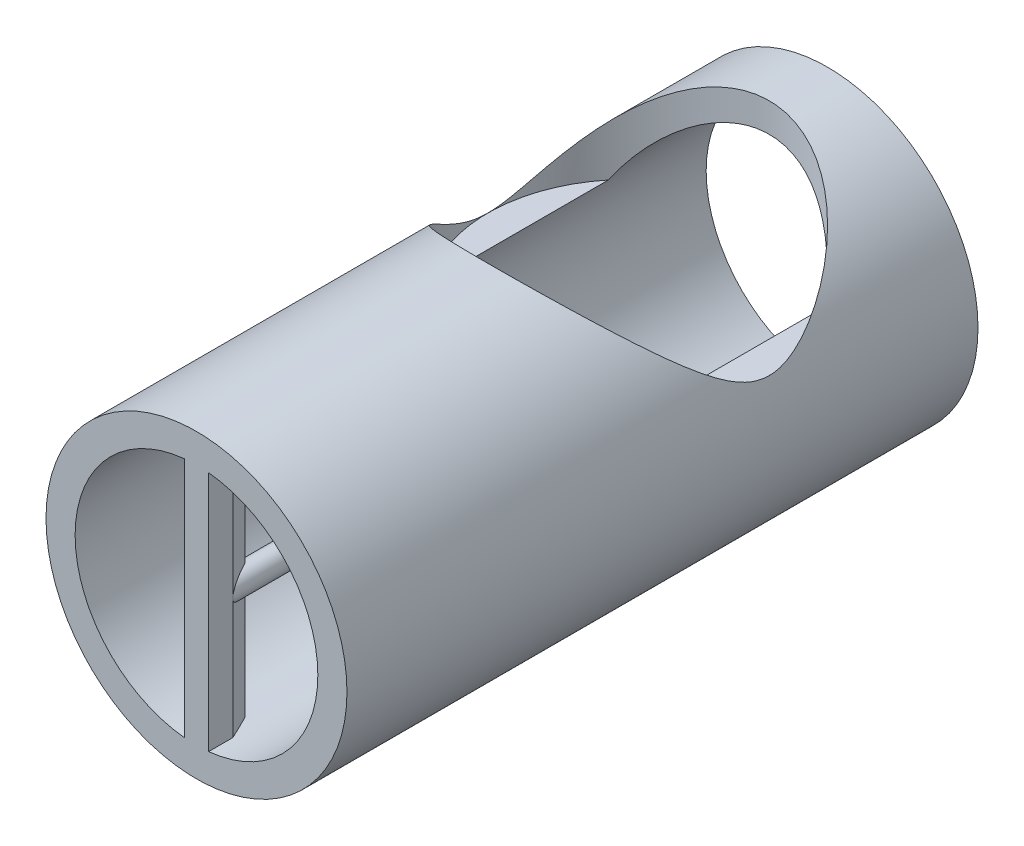
ISO-10303-21;
HEADER;
FILE_DESCRIPTION(('STEP AP214'),'2;1');
FILE_NAME('part.step','',(''),(''),'','','');
FILE_SCHEMA(('AUTOMOTIVE_DESIGN { 1 0 10303 214 1 1 1 1 }'));
ENDSEC;
DATA;
#1=APPLICATION_CONTEXT('core data for automotive mechanical design processes');
#2=APPLICATION_PROTOCOL_DEFINITION('international standard','automotive_design',2000,#1);
#3=PRODUCT_CONTEXT('',#1,'mechanical');
#4=PRODUCT('Part','Part','',(#3));
#5=PRODUCT_RELATED_PRODUCT_CATEGORY('part','',(#4));
#6=PRODUCT_DEFINITION_FORMATION('','',#4);
#7=PRODUCT_DEFINITION_CONTEXT('part definition',#1,'design');
#8=PRODUCT_DEFINITION('design','',#6,#7);
#9=PRODUCT_DEFINITION_SHAPE('','',#8);
#10=(LENGTH_UNIT() NAMED_UNIT(*) SI_UNIT(.MILLI.,.METRE.));
#11=(NAMED_UNIT(*) PLANE_ANGLE_UNIT() SI_UNIT($,.RADIAN.));
#12=(NAMED_UNIT(*) SI_UNIT($,.STERADIAN.) SOLID_ANGLE_UNIT());
#13=UNCERTAINTY_MEASURE_WITH_UNIT(LENGTH_MEASURE(1.E-05),#10,'distance_accuracy_value','');
#14=(GEOMETRIC_REPRESENTATION_CONTEXT(3) GLOBAL_UNCERTAINTY_ASSIGNED_CONTEXT((#13)) GLOBAL_UNIT_ASSIGNED_CONTEXT((#10,
#11,#12)) REPRESENTATION_CONTEXT('',''));
#15=CARTESIAN_POINT('',(0.,0.,0.));
#16=DIRECTION('',(0.,0.,1.));
#17=DIRECTION('',(1.,0.,0.));
#18=AXIS2_PLACEMENT_3D('',#15,#16,#17);
#19=CARTESIAN_POINT('',(0.,-500000.,120.));
#20=DIRECTION('',(-0.894427190999915,0.,-0.447213595499959));
#21=DIRECTION('',(-0.447213595499959,0.,0.894427190999916));
#22=AXIS2_PLACEMENT_3D('',#19,#20,#21);
#23=PLANE('',#22);
#24=CARTESIAN_POINT('',(0.,0.,120.));
#25=DIRECTION('',(-0.894427190999915,0.,-0.447213595499959));
#26=DIRECTION('',(-0.447213595499959,0.,0.894427190999916));
#27=AXIS2_PLACEMENT_3D('',#24,#25,#26);
#28=ELLIPSE('',#27,5.59016994374947,2.5);
#29=CARTESIAN_POINT('',(-2.5,-1.13686837721616E-10,125.));
#30=VERTEX_POINT('',#29);
#31=CARTESIAN_POINT('',(0.,2.49999999965667,120.));
#32=VERTEX_POINT('',#31);
#33=EDGE_CURVE('E51',#30,#32,#28,.T.);
#34=ORIENTED_EDGE('',*,*,#33,.F.);
#35=DIRECTION('',(0.,1.,0.));
#36=VECTOR('',#35,1.);
#37=CARTESIAN_POINT('',(-2.5,-500000.,125.));
#38=LINE('',#37,#36);
#39=CARTESIAN_POINT('',(-2.5,24.8746859273297,125.));
#40=VERTEX_POINT('',#39);
#41=EDGE_CURVE('E153',#30,#40,#38,.T.);
#42=ORIENTED_EDGE('',*,*,#41,.T.);
#43=CARTESIAN_POINT('',(0.,0.,120.));
#44=DIRECTION('',(0.894427190999915,0.,0.447213595499959));
#45=DIRECTION('',(0.447213595499959,0.,-0.894427190999916));
#46=AXIS2_PLACEMENT_3D('',#43,#44,#45);
#47=ELLIPSE('',#46,55.9016994374947,25.);
#48=CARTESIAN_POINT('',(0.,24.9999999996362,120.));
#49=VERTEX_POINT('',#48);
#50=EDGE_CURVE('E145',#40,#49,#47,.F.);
#51=ORIENTED_EDGE('',*,*,#50,.T.);
#52=DIRECTION('',(0.,1.,0.));
#53=VECTOR('',#52,1.);
#54=CARTESIAN_POINT('',(0.,-500000.,120.));
#55=LINE('',#54,#53);
#56=EDGE_CURVE('E157',#32,#49,#55,.T.);
#57=ORIENTED_EDGE('',*,*,#56,.F.);
#58=EDGE_LOOP('',(#34,#42,#51,#57));
#59=FACE_BOUND('',#58,.T.);
#60=ADVANCED_FACE('F35',(#59),#23,.T.);
#61=CARTESIAN_POINT('',(0.,-500000.,120.));
#62=DIRECTION('',(0.894427190999915,0.,-0.447213595499959));
#63=DIRECTION('',(-0.447213595499959,0.,-0.894427190999916));
#64=AXIS2_PLACEMENT_3D('',#61,#62,#63);
#65=PLANE('',#64);
#66=CARTESIAN_POINT('',(0.,0.,120.));
#67=DIRECTION('',(0.894427190999915,0.,-0.447213595499959));
#68=DIRECTION('',(0.447213595499959,0.,0.894427190999916));
#69=AXIS2_PLACEMENT_3D('',#66,#67,#68);
#70=ELLIPSE('',#69,5.59016994374947,2.5);
#71=CARTESIAN_POINT('',(2.5,0.,125.));
#72=VERTEX_POINT('',#71);
#73=CARTESIAN_POINT('',(0.,-2.50000000033879,120.));
#74=VERTEX_POINT('',#73);
#75=EDGE_CURVE('E127',#72,#74,#70,.T.);
#76=ORIENTED_EDGE('',*,*,#75,.F.);
#77=DIRECTION('',(0.,1.,0.));
#78=VECTOR('',#77,1.);
#79=CARTESIAN_POINT('',(2.5,-500000.,125.));
#80=LINE('',#79,#78);
#81=CARTESIAN_POINT('',(2.5,-24.8746859276655,125.));
#82=VERTEX_POINT('',#81);
#83=EDGE_CURVE('E108',#82,#72,#80,.T.);
#84=ORIENTED_EDGE('',*,*,#83,.F.);
#85=CARTESIAN_POINT('',(0.,0.,120.));
#86=DIRECTION('',(0.894427190999915,0.,-0.447213595499959));
#87=DIRECTION('',(-0.447213595499959,0.,-0.894427190999916));
#88=AXIS2_PLACEMENT_3D('',#85,#86,#87);
#89=ELLIPSE('',#88,55.9016994374947,25.);
#90=CARTESIAN_POINT('',(0.,-25.,120.));
#91=VERTEX_POINT('',#90);
#92=EDGE_CURVE('E159',#91,#82,#89,.F.);
#93=ORIENTED_EDGE('',*,*,#92,.F.);
#94=EDGE_CURVE('E130',#91,#74,#55,.T.);
#95=ORIENTED_EDGE('',*,*,#94,.T.);
#96=EDGE_LOOP('',(#76,#84,#93,#95));
#97=FACE_BOUND('',#96,.T.);
#98=ADVANCED_FACE('F128',(#97),#65,.T.);
#99=CARTESIAN_POINT('',(0.,0.,130.));
#100=DIRECTION('',(0.,0.,-1.));
#101=DIRECTION('',(-1.,0.,0.));
#102=AXIS2_PLACEMENT_3D('',#99,#100,#101);
#103=CYLINDRICAL_SURFACE('',#102,25.);
#104=DIRECTION('',(0.,0.,-1.));
#105=VECTOR('',#104,1.);
#106=CARTESIAN_POINT('',(-2.5,-24.8746859276655,130.));
#107=LINE('',#106,#105);
#108=CARTESIAN_POINT('',(-2.5,-24.8746859276655,130.));
#109=VERTEX_POINT('',#108);
#110=CARTESIAN_POINT('',(-2.49999999999761,-24.8746859276657,124.999999999995));
#111=VERTEX_POINT('',#110);
#112=EDGE_CURVE('E162',#109,#111,#107,.T.);
#113=ORIENTED_EDGE('',*,*,#112,.T.);
#114=CARTESIAN_POINT('',(0.,0.,120.));
#115=DIRECTION('',(-0.894427190999915,0.,-0.447213595499959));
#116=DIRECTION('',(0.447213595499959,0.,-0.894427190999916));
#117=AXIS2_PLACEMENT_3D('',#114,#115,#116);
#118=ELLIPSE('',#117,55.9016994374947,25.);
#119=EDGE_CURVE('E164',#111,#91,#118,.F.);
#120=ORIENTED_EDGE('',*,*,#119,.T.);
#121=ORIENTED_EDGE('',*,*,#92,.T.);
#122=DIRECTION('',(0.,0.,-1.));
#123=VECTOR('',#122,1.);
#124=CARTESIAN_POINT('',(2.5,-24.8746859276655,130.));
#125=LINE('',#124,#123);
#126=CARTESIAN_POINT('',(2.5,-24.8746859277844,130.));
#127=VERTEX_POINT('',#126);
#128=EDGE_CURVE('E115',#82,#127,#125,.F.);
#129=ORIENTED_EDGE('',*,*,#128,.T.);
#130=CARTESIAN_POINT('',(0.,0.,130.));
#131=DIRECTION('',(0.,0.,1.));
#132=DIRECTION('',(1.,0.,0.));
#133=AXIS2_PLACEMENT_3D('',#130,#131,#132);
#134=CIRCLE('',#133,25.);
#135=CARTESIAN_POINT('',(2.49999999998817,24.8746859276667,130.));
#136=VERTEX_POINT('',#135);
#137=EDGE_CURVE('E177',#127,#136,#134,.T.);
#138=ORIENTED_EDGE('',*,*,#137,.T.);
#139=DIRECTION('',(0.,0.,-1.));
#140=VECTOR('',#139,1.);
#141=CARTESIAN_POINT('',(2.5,24.8746859276655,130.));
#142=LINE('',#141,#140);
#143=CARTESIAN_POINT('',(2.5,24.8746859276655,125.));
#144=VERTEX_POINT('',#143);
#145=EDGE_CURVE('E141',#144,#136,#142,.F.);
#146=ORIENTED_EDGE('',*,*,#145,.F.);
#147=CARTESIAN_POINT('',(0.,0.,120.));
#148=DIRECTION('',(-0.894427190999915,0.,0.447213595499959));
#149=DIRECTION('',(-0.447213595499959,0.,-0.894427190999916));
#150=AXIS2_PLACEMENT_3D('',#147,#148,#149);
#151=ELLIPSE('',#150,55.9016994374947,25.);
#152=EDGE_CURVE('E124',#49,#144,#151,.F.);
#153=ORIENTED_EDGE('',*,*,#152,.F.);
#154=ORIENTED_EDGE('',*,*,#50,.F.);
#155=DIRECTION('',(0.,0.,-1.));
#156=VECTOR('',#155,1.);
#157=CARTESIAN_POINT('',(-2.5,24.8746859276655,130.));
#158=LINE('',#157,#156);
#159=CARTESIAN_POINT('',(-2.5,24.8746859276655,130.));
#160=VERTEX_POINT('',#159);
#161=EDGE_CURVE('E143',#160,#40,#158,.T.);
#162=ORIENTED_EDGE('',*,*,#161,.F.);
#163=EDGE_CURVE('E216',#160,#109,#134,.T.);
#164=ORIENTED_EDGE('',*,*,#163,.T.);
#165=EDGE_LOOP('',(#113,#120,#121,#129,#138,#146,#153,#154,#162,#164));
#166=FACE_BOUND('',#165,.T.);
#167=CARTESIAN_POINT('',(0.,0.,0.));
#168=DIRECTION('',(0.,0.,1.));
#169=DIRECTION('',(1.,0.,0.));
#170=AXIS2_PLACEMENT_3D('',#167,#168,#169);
#171=CIRCLE('',#170,25.);
#172=CARTESIAN_POINT('',(25.,0.,0.));
#173=VERTEX_POINT('',#172);
#174=EDGE_CURVE('E176',#173,#173,#171,.T.);
#175=ORIENTED_EDGE('',*,*,#174,.F.);
#176=EDGE_LOOP('',(#175));
#177=FACE_BOUND('',#176,.T.);
#178=CARTESIAN_POINT('',(22.4743742960733,10.95,59.3276430563234));
#179=CARTESIAN_POINT('',(22.3019667083182,11.3037942212565,59.5390901029748));
#180=CARTESIAN_POINT('',(22.1220062083574,11.6519990272461,59.753646243183));
#181=CARTESIAN_POINT('',(21.7471646299782,12.3374955462132,60.1870423380014));
#182=CARTESIAN_POINT('',(21.5522849025751,12.6747882434144,60.405881903392));
#183=CARTESIAN_POINT('',(21.1476300871424,13.3390015573137,60.8460895123145));
#184=CARTESIAN_POINT('',(20.9378455943647,13.6659154334671,61.0674590769942));
#185=CARTESIAN_POINT('',(20.5035619866832,14.3092474384923,61.5109802440593));
#186=CARTESIAN_POINT('',(20.2790624669886,14.625665278271,61.7331318677988));
#187=CARTESIAN_POINT('',(19.5795063668447,15.5645745760457,62.4023717124672));
#188=CARTESIAN_POINT('',(19.0818003536356,16.1711250172771,62.8484848216621));
#189=CARTESIAN_POINT('',(18.0263581578649,17.3398369519749,63.7271202977906));
#190=CARTESIAN_POINT('',(17.4686424726122,17.9020134890678,64.1596472405025));
#191=CARTESIAN_POINT('',(16.4114713979435,18.8697674088573,64.9164524239288));
#192=CARTESIAN_POINT('',(15.9229916706646,19.2840441660308,65.2449531621064));
#193=CARTESIAN_POINT('',(14.9075161135777,20.0793879733808,65.8822265839081));
#194=CARTESIAN_POINT('',(14.3805218768934,20.4604563957672,66.1910000825456));
#195=CARTESIAN_POINT('',(13.2903561179992,21.1847415952306,66.7827433053698));
#196=CARTESIAN_POINT('',(12.7273081621061,21.528077743543,67.0657938849646));
#197=CARTESIAN_POINT('',(11.5648381171561,22.1742291664302,67.6019536389646));
#198=CARTESIAN_POINT('',(10.9654233744445,22.4770525855074,67.8550688302592));
#199=CARTESIAN_POINT('',(9.84913431381633,22.9846953384824,68.2815147432458));
#200=CARTESIAN_POINT('',(9.33806130892662,23.1972214584249,68.4608843309504));
#201=CARTESIAN_POINT('',(8.29548014062666,23.5901509402475,68.7936016043488));
#202=CARTESIAN_POINT('',(7.76397425938417,23.7705578769489,68.946952185833));
#203=CARTESIAN_POINT('',(6.68311418470487,24.0967758224872,69.2249414576358));
#204=CARTESIAN_POINT('',(6.13376100025002,24.2425887832088,69.3495817678531));
#205=CARTESIAN_POINT('',(5.02046202300811,24.4973671948911,69.567755737929));
#206=CARTESIAN_POINT('',(4.45651605234143,24.6063321964636,69.661289018414));
#207=CARTESIAN_POINT('',(3.3151446007866,24.7859880434769,69.8156741807081));
#208=CARTESIAN_POINT('',(2.7376655547893,24.8564834540152,69.8763591728327));
#209=CARTESIAN_POINT('',(1.57658573948294,24.9570411730376,69.9629634007423));
#210=CARTESIAN_POINT('',(0.992984959715098,24.9871034124315,69.9888825771214));
#211=CARTESIAN_POINT('',(-0.175294620092876,25.0062099656625,70.0053531926622));
#212=CARTESIAN_POINT('',(-0.759973234393823,24.9952607869556,69.9959102428828));
#213=CARTESIAN_POINT('',(-1.92547633868596,24.9325707360905,69.9418870969705));
#214=CARTESIAN_POINT('',(-2.50630102122905,24.8808319175958,69.8973086698271));
#215=CARTESIAN_POINT('',(-3.61166501476056,24.7434844240643,69.7791402561338));
#216=CARTESIAN_POINT('',(-4.1368914702396,24.6610255447947,69.7082500382798));
#217=CARTESIAN_POINT('',(-5.17671937593841,24.4638831371384,69.5390787466375));
#218=CARTESIAN_POINT('',(-5.69132153712214,24.3492017725909,69.4407995121098));
#219=CARTESIAN_POINT('',(-6.70699615280654,24.0892304743416,69.2185485117049));
#220=CARTESIAN_POINT('',(-7.20806928276045,23.943942071933,69.0945780311852));
#221=CARTESIAN_POINT('',(-8.19434588170743,23.624593822159,68.8229112463909));
#222=CARTESIAN_POINT('',(-8.67954838769014,23.4505322327365,68.6752135055774));
#223=CARTESIAN_POINT('',(-9.66528721001278,23.0625656280626,68.3472203128465));
#224=CARTESIAN_POINT('',(-10.1645467091083,22.8467325959106,68.1653729993755));
#225=CARTESIAN_POINT('',(-11.1410201906496,22.3868038464551,67.779717778957));
#226=CARTESIAN_POINT('',(-11.6182336841592,22.1427075027486,67.5759093852905));
#227=CARTESIAN_POINT('',(-12.5498726719313,21.6283175646381,67.1488726002661));
#228=CARTESIAN_POINT('',(-13.0042769987812,21.3580002946056,66.9256266771791));
#229=CARTESIAN_POINT('',(-13.889207366557,20.793399429605,66.4625091004891));
#230=CARTESIAN_POINT('',(-14.3197284901996,20.4991109297893,66.222634045837));
#231=CARTESIAN_POINT('',(-15.0533368062141,19.9637027544719,65.789737731696));
#232=CARTESIAN_POINT('',(-15.3616977937813,19.7273360827789,65.5997248716302));
#233=CARTESIAN_POINT('',(-15.9644465845346,19.2428150382415,65.2129033958806));
#234=CARTESIAN_POINT('',(-16.2588366450119,18.9946625826856,65.01609588695));
#235=CARTESIAN_POINT('',(-17.1214114065351,18.2331015939417,64.4168199080071));
#236=CARTESIAN_POINT('',(-17.6687806018851,17.7027508921876,64.0056293228935));
#237=CARTESIAN_POINT('',(-18.7079772540656,16.6007691605572,63.1688268217915));
#238=CARTESIAN_POINT('',(-19.1997944216842,16.0291305154674,62.7432122531442));
#239=CARTESIAN_POINT('',(-20.128070528792,14.846734468062,61.886812834448));
#240=CARTESIAN_POINT('',(-20.5645587763765,14.235998036332,61.4560308551111));
#241=CARTESIAN_POINT('',(-21.2492030013533,13.1805903160196,60.7390723178791));
#242=CARTESIAN_POINT('',(-21.5124112441779,12.7465818015702,60.4514736104248));
#243=CARTESIAN_POINT('',(-21.887847489492,12.0824886020625,60.0251900789776));
#244=CARTESIAN_POINT('',(-22.0096022085189,11.8592746919453,59.8841472909865));
#245=CARTESIAN_POINT('',(-22.2467652468319,11.4081690793529,59.6041700849085));
#246=CARTESIAN_POINT('',(-22.3621729856259,11.1802769516189,59.4652358605085));
#247=CARTESIAN_POINT('',(-22.4743742960733,10.95,59.3276430563234));
#248=B_SPLINE_CURVE_WITH_KNOTS('',3,(#178,#179,#180,#181,#182,#183,#184,#185,#186,#187,#188,
#189,#190,#191,#192,#193,#194,#195,#196,#197,#198,#199,#200,#201,#202,#203,#204,#205,#206,#207,
#208,#209,#210,#211,#212,#213,#214,#215,#216,#217,#218,#219,#220,#221,#222,#223,#224,#225,#226,
#227,#228,#229,#230,#231,#232,#233,#234,#235,#236,#237,#238,#239,#240,#241,#242,#243,#244,#245,
#246,#247),.UNSPECIFIED.,.F.,.F.,(4,2,2,2,2,2,2,2,2,2,2,2,2,2,2,2,2,2,2,2,2,2,2,2,2,2,2,2,2,2,2,
2,2,2,4),(0.,1.34014474584248,2.68016827767678,4.02104499094421,5.36195860544389,
8.06638426766958,10.7698891028818,12.9274929793113,15.0850076585408,17.2354873322471,
19.3855340311673,21.1293748113673,22.8730213829757,24.6165695499755,26.3601389800772,
28.1124856051795,29.8648352245974,31.6169068030324,33.3688901743713,34.9761950729561,
36.583392061854,38.1905086605647,39.797722596949,41.5166029699499,43.2355214459951,
44.9560066920428,46.676844861941,47.9739182305634,49.2707813117535,51.8654130237684,
54.4605245218661,57.0542555761574,58.8036229900976,59.6758001678601,60.5480569823711),.UNSPECIFIED.);
#249=CARTESIAN_POINT('',(22.4743742960733,10.95,59.3276430563234));
#250=VERTEX_POINT('',#249);
#251=CARTESIAN_POINT('',(-22.4743742960733,10.95,59.3276430563234));
#252=VERTEX_POINT('',#251);
#253=EDGE_CURVE('E44',#250,#252,#248,.T.);
#254=ORIENTED_EDGE('',*,*,#253,.F.);
#255=DIRECTION('',(0.,0.,-1.));
#256=VECTOR('',#255,1.);
#257=CARTESIAN_POINT('',(22.4743742960733,10.95,130.));
#258=LINE('',#257,#256);
#259=CARTESIAN_POINT('',(22.4743742960733,10.95,22.6723569436766));
#260=VERTEX_POINT('',#259);
#261=EDGE_CURVE('E11',#250,#260,#258,.T.);
#262=ORIENTED_EDGE('',*,*,#261,.T.);
#263=CARTESIAN_POINT('',(-22.4743742960733,10.95,22.6723569436766));
#264=CARTESIAN_POINT('',(-22.3019667083182,11.3037942212565,22.4609098970252));
#265=CARTESIAN_POINT('',(-22.1220062083574,11.6519990272461,22.246353756817));
#266=CARTESIAN_POINT('',(-21.7471646299782,12.3374955462132,21.8129576619986));
#267=CARTESIAN_POINT('',(-21.5522849025751,12.6747882434144,21.594118096608));
#268=CARTESIAN_POINT('',(-21.1476300871424,13.3390015573137,21.1539104876855));
#269=CARTESIAN_POINT('',(-20.9378455943647,13.6659154334671,20.9325409230058));
#270=CARTESIAN_POINT('',(-20.5035619866832,14.3092474384923,20.4890197559407));
#271=CARTESIAN_POINT('',(-20.2790624669886,14.625665278271,20.2668681322012));
#272=CARTESIAN_POINT('',(-19.5795063668447,15.5645745760457,19.5976282875328));
#273=CARTESIAN_POINT('',(-19.0818003536356,16.1711250172771,19.1515151783379));
#274=CARTESIAN_POINT('',(-18.0263581578649,17.3398369519749,18.2728797022094));
#275=CARTESIAN_POINT('',(-17.4686424726122,17.9020134890678,17.8403527594975));
#276=CARTESIAN_POINT('',(-16.4114713979435,18.8697674088573,17.0835475760712));
#277=CARTESIAN_POINT('',(-15.9229916706646,19.2840441660308,16.7550468378936));
#278=CARTESIAN_POINT('',(-14.9075161135777,20.0793879733808,16.1177734160919));
#279=CARTESIAN_POINT('',(-14.3805218768934,20.4604563957672,15.8089999174544));
#280=CARTESIAN_POINT('',(-13.2903561179992,21.1847415952306,15.2172566946302));
#281=CARTESIAN_POINT('',(-12.7273081621061,21.528077743543,14.9342061150354));
#282=CARTESIAN_POINT('',(-11.5648381171561,22.1742291664302,14.3980463610354));
#283=CARTESIAN_POINT('',(-10.9654233744445,22.4770525855074,14.1449311697408));
#284=CARTESIAN_POINT('',(-9.84913431381633,22.9846953384824,13.7184852567542));
#285=CARTESIAN_POINT('',(-9.33806130892662,23.1972214584248,13.5391156690496));
#286=CARTESIAN_POINT('',(-8.29548014062667,23.5901509402475,13.2063983956512));
#287=CARTESIAN_POINT('',(-7.76397425938417,23.7705578769489,13.053047814167));
#288=CARTESIAN_POINT('',(-6.68311418470488,24.0967758224872,12.7750585423642));
#289=CARTESIAN_POINT('',(-6.13376100025003,24.2425887832088,12.6504182321469));
#290=CARTESIAN_POINT('',(-5.02046202300812,24.4973671948911,12.432244262071));
#291=CARTESIAN_POINT('',(-4.45651605234144,24.6063321964636,12.338710981586));
#292=CARTESIAN_POINT('',(-3.31514460078661,24.7859880434769,12.1843258192919));
#293=CARTESIAN_POINT('',(-2.73766555478931,24.8564834540152,12.1236408271674));
#294=CARTESIAN_POINT('',(-1.57658573948295,24.9570411730376,12.0370365992577));
#295=CARTESIAN_POINT('',(-0.992984959715112,24.9871034124315,12.0111174228786));
#296=CARTESIAN_POINT('',(0.17529462009286,25.0062099656625,11.9946468073378));
#297=CARTESIAN_POINT('',(0.759973234393806,24.9952607869556,12.0040897571172));
#298=CARTESIAN_POINT('',(1.92547633868595,24.9325707360905,12.0581129030295));
#299=CARTESIAN_POINT('',(2.50630102122904,24.8808319175958,12.1026913301729));
#300=CARTESIAN_POINT('',(3.61166501476055,24.7434844240643,12.2208597438662));
#301=CARTESIAN_POINT('',(4.13689147023959,24.6610255447947,12.2917499617202));
#302=CARTESIAN_POINT('',(5.1767193759384,24.4638831371384,12.4609212533625));
#303=CARTESIAN_POINT('',(5.69132153712213,24.3492017725909,12.5592004878902));
#304=CARTESIAN_POINT('',(6.70699615280653,24.0892304743416,12.7814514882951));
#305=CARTESIAN_POINT('',(7.20806928276044,23.943942071933,12.9054219688148));
#306=CARTESIAN_POINT('',(8.19434588170742,23.624593822159,13.1770887536091));
#307=CARTESIAN_POINT('',(8.67954838769013,23.4505322327365,13.3247864944226));
#308=CARTESIAN_POINT('',(9.66528721001277,23.0625656280626,13.6527796871535));
#309=CARTESIAN_POINT('',(10.1645467091083,22.8467325959106,13.8346270006245));
#310=CARTESIAN_POINT('',(11.1410201906496,22.3868038464551,14.2202822210429));
#311=CARTESIAN_POINT('',(11.6182336841592,22.1427075027486,14.4240906147095));
#312=CARTESIAN_POINT('',(12.5498726719313,21.6283175646381,14.8511273997339));
#313=CARTESIAN_POINT('',(13.0042769987812,21.3580002946056,15.074373322821));
#314=CARTESIAN_POINT('',(13.889207366557,20.793399429605,15.5374908995109));
#315=CARTESIAN_POINT('',(14.3197284901996,20.4991109297893,15.777365954163));
#316=CARTESIAN_POINT('',(15.0533368062141,19.9637027544719,16.210262268304));
#317=CARTESIAN_POINT('',(15.3616977937813,19.7273360827789,16.4002751283698));
#318=CARTESIAN_POINT('',(15.9644465845346,19.2428150382415,16.7870966041194));
#319=CARTESIAN_POINT('',(16.2588366450118,18.9946625826856,16.98390411305));
#320=CARTESIAN_POINT('',(17.1214114065351,18.2331015939417,17.5831800919929));
#321=CARTESIAN_POINT('',(17.6687806018851,17.7027508921876,17.9943706771065));
#322=CARTESIAN_POINT('',(18.7079772540656,16.6007691605572,18.8311731782085));
#323=CARTESIAN_POINT('',(19.1997944216842,16.0291305154674,19.2567877468558));
#324=CARTESIAN_POINT('',(20.128070528792,14.846734468062,20.113187165552));
#325=CARTESIAN_POINT('',(20.5645587763765,14.235998036332,20.5439691448889));
#326=CARTESIAN_POINT('',(21.2492030013533,13.1805903160196,21.2609276821209));
#327=CARTESIAN_POINT('',(21.5124112441779,12.7465818015702,21.5485263895752));
#328=CARTESIAN_POINT('',(21.887847489492,12.0824886020625,21.9748099210224));
#329=CARTESIAN_POINT('',(22.0096022085189,11.8592746919453,22.1158527090135));
#330=CARTESIAN_POINT('',(22.2467652468319,11.4081690793529,22.3958299150915));
#331=CARTESIAN_POINT('',(22.3621729856259,11.1802769516189,22.5347641394915));
#332=CARTESIAN_POINT('',(22.4743742960733,10.95,22.6723569436766));
#333=B_SPLINE_CURVE_WITH_KNOTS('',3,(#263,#264,#265,#266,#267,#268,#269,#270,#271,#272,#273,
#274,#275,#276,#277,#278,#279,#280,#281,#282,#283,#284,#285,#286,#287,#288,#289,#290,#291,#292,
#293,#294,#295,#296,#297,#298,#299,#300,#301,#302,#303,#304,#305,#306,#307,#308,#309,#310,#311,
#312,#313,#314,#315,#316,#317,#318,#319,#320,#321,#322,#323,#324,#325,#326,#327,#328,#329,#330,
#331,#332),.UNSPECIFIED.,.F.,.F.,(4,2,2,2,2,2,2,2,2,2,2,2,2,2,2,2,2,2,2,2,2,2,2,2,2,2,2,2,2,2,2,
2,2,2,4),(0.,1.34014474584249,2.68016827767678,4.02104499094421,5.36195860544389,
8.06638426766957,10.7698891028818,12.9274929793113,15.0850076585407,17.2354873322471,
19.3855340311673,21.1293748113673,22.8730213829757,24.6165695499755,26.3601389800772,
28.1124856051795,29.8648352245974,31.6169068030324,33.3688901743713,34.9761950729561,
36.583392061854,38.1905086605647,39.797722596949,41.5166029699499,43.2355214459951,
44.9560066920428,46.676844861941,47.9739182305634,49.2707813117535,51.8654130237684,
54.4605245218661,57.0542555761574,58.8036229900976,59.6758001678601,60.5480569823711),.UNSPECIFIED.);
#334=CARTESIAN_POINT('',(-22.4743742960733,10.95,22.6723569436766));
#335=VERTEX_POINT('',#334);
#336=EDGE_CURVE('E194',#335,#260,#333,.T.);
#337=ORIENTED_EDGE('',*,*,#336,.F.);
#338=DIRECTION('',(0.,0.,-1.));
#339=VECTOR('',#338,1.);
#340=CARTESIAN_POINT('',(-22.4743742960733,10.95,130.));
#341=LINE('',#340,#339);
#342=EDGE_CURVE('E207',#335,#252,#341,.F.);
#343=ORIENTED_EDGE('',*,*,#342,.T.);
#344=EDGE_LOOP('',(#254,#262,#337,#343));
#345=FACE_BOUND('',#344,.T.);
#346=ADVANCED_FACE('F188',(#166,#177,#345),#103,.F.);
#347=CARTESIAN_POINT('',(0.,0.,130.));
#348=DIRECTION('',(0.,0.,1.));
#349=DIRECTION('',(1.,0.,0.));
#350=AXIS2_PLACEMENT_3D('',#347,#348,#349);
#351=PLANE('',#350);
#352=ORIENTED_EDGE('',*,*,#163,.F.);
#353=DIRECTION('',(0.,1.,0.));
#354=VECTOR('',#353,1.);
#355=CARTESIAN_POINT('',(-2.5,-500000.,130.));
#356=LINE('',#355,#354);
#357=EDGE_CURVE('E151',#109,#160,#356,.T.);
#358=ORIENTED_EDGE('',*,*,#357,.F.);
#359=EDGE_LOOP('',(#352,#358));
#360=FACE_BOUND('',#359,.T.);
#361=DIRECTION('',(0.,1.,0.));
#362=VECTOR('',#361,1.);
#363=CARTESIAN_POINT('',(2.5,-500000.,130.));
#364=LINE('',#363,#362);
#365=EDGE_CURVE('E119',#127,#136,#364,.T.);
#366=ORIENTED_EDGE('',*,*,#365,.T.);
#367=ORIENTED_EDGE('',*,*,#137,.F.);
#368=EDGE_LOOP('',(#366,#367));
#369=FACE_BOUND('',#368,.T.);
#370=CARTESIAN_POINT('',(0.,0.,130.));
#371=DIRECTION('',(0.,0.,1.));
#372=DIRECTION('',(1.,0.,0.));
#373=AXIS2_PLACEMENT_3D('',#370,#371,#372);
#374=CIRCLE('',#373,31.);
#375=CARTESIAN_POINT('',(31.,0.,130.));
#376=VERTEX_POINT('',#375);
#377=EDGE_CURVE('E209',#376,#376,#374,.T.);
#378=ORIENTED_EDGE('',*,*,#377,.T.);
#379=EDGE_LOOP('',(#378));
#380=FACE_BOUND('',#379,.T.);
#381=ADVANCED_FACE('F233',(#360,#369,#380),#351,.T.);
#382=CARTESIAN_POINT('',(0.,0.,0.));
#383=DIRECTION('',(0.,0.,1.));
#384=DIRECTION('',(1.,0.,0.));
#385=AXIS2_PLACEMENT_3D('',#382,#383,#384);
#386=PLANE('',#385);
#387=CARTESIAN_POINT('',(0.,0.,0.));
#388=DIRECTION('',(0.,0.,1.));
#389=DIRECTION('',(1.,0.,0.));
#390=AXIS2_PLACEMENT_3D('',#387,#388,#389);
#391=CIRCLE('',#390,31.);
#392=CARTESIAN_POINT('',(31.,0.,0.));
#393=VERTEX_POINT('',#392);
#394=EDGE_CURVE('E212',#393,#393,#391,.T.);
#395=ORIENTED_EDGE('',*,*,#394,.F.);
#396=EDGE_LOOP('',(#395));
#397=FACE_BOUND('',#396,.T.);
#398=ORIENTED_EDGE('',*,*,#174,.T.);
#399=EDGE_LOOP('',(#398));
#400=FACE_BOUND('',#399,.T.);
#401=ADVANCED_FACE('F236',(#397,#400),#386,.F.);
#402=CARTESIAN_POINT('',(0.,0.,130.));
#403=DIRECTION('',(0.,0.,-1.));
#404=DIRECTION('',(-1.,0.,0.));
#405=AXIS2_PLACEMENT_3D('',#402,#403,#404);
#406=CYLINDRICAL_SURFACE('',#405,31.);
#407=CARTESIAN_POINT('',(0.,31.,70.));
#408=CARTESIAN_POINT('',(-0.663476460951134,31.0000006688418,70.0000006760147));
#409=CARTESIAN_POINT('',(-1.32694472503453,30.9786593200945,69.9771908917686));
#410=CARTESIAN_POINT('',(-2.64804227733868,30.8937859066056,69.886437393459));
#411=CARTESIAN_POINT('',(-3.3056716240038,30.8302542646492,69.8184941316742));
#412=CARTESIAN_POINT('',(-4.60984908205656,30.6623837667219,69.6388337913666));
#413=CARTESIAN_POINT('',(-5.25639298094963,30.558029741832,69.5271004411461));
#414=CARTESIAN_POINT('',(-6.53331210972513,30.3107048752081,69.2620081438586));
#415=CARTESIAN_POINT('',(-7.16368692994254,30.1677330560974,69.1086481432632));
#416=CARTESIAN_POINT('',(-8.40027546388511,29.8469575625866,68.7640919921698));
#417=CARTESIAN_POINT('',(-9.00661696526691,29.6693803432953,68.5731417508109));
#418=CARTESIAN_POINT('',(-10.1962119281453,29.2818822597091,68.1557479007108));
#419=CARTESIAN_POINT('',(-10.779466017348,29.0719622755174,67.9293052577769));
#420=CARTESIAN_POINT('',(-11.9206160309951,28.6229792271756,67.4439677821929));
#421=CARTESIAN_POINT('',(-12.47851183932,28.3839160295927,67.185072800959));
#422=CARTESIAN_POINT('',(-13.5675434447839,27.8797756743982,66.6377311000745));
#423=CARTESIAN_POINT('',(-14.0986730788055,27.6146925665475,66.3492776203136));
#424=CARTESIAN_POINT('',(-14.9791961359444,27.1439404825786,65.8354729668611));
#425=CARTESIAN_POINT('',(-15.3356648911216,26.944044792128,65.6168649695009));
#426=CARTESIAN_POINT('',(-16.0345967421318,26.5340505840314,65.1674223069109));
#427=CARTESIAN_POINT('',(-16.3770627532522,26.3239542102363,64.9365902098711));
#428=CARTESIAN_POINT('',(-17.3836862668733,25.6796080122045,64.2267480654489));
#429=CARTESIAN_POINT('',(-18.0269167109951,25.2313834401978,63.7304818210384));
#430=CARTESIAN_POINT('',(-19.2590030555795,24.3040603764164,62.6965391767546));
#431=CARTESIAN_POINT('',(-19.8476937971443,23.8248751168649,62.1587454940371));
#432=CARTESIAN_POINT('',(-20.9695514961933,22.8436633940546,61.0474735351565));
#433=CARTESIAN_POINT('',(-21.5027240333369,22.3416392334392,60.4739988542574));
#434=CARTESIAN_POINT('',(-22.3286321423887,21.5090375311366,59.5114438901453));
#435=CARTESIAN_POINT('',(-22.6377085246247,21.1832698449197,59.1320679949102));
#436=CARTESIAN_POINT('',(-23.2344858313911,20.5269421535818,58.3607733250829));
#437=CARTESIAN_POINT('',(-23.5221855338007,20.1963818757541,57.9688538351939));
#438=CARTESIAN_POINT('',(-24.0766578212336,19.5320728059757,57.1725117310288));
#439=CARTESIAN_POINT('',(-24.3434154254364,19.1983219196784,56.7680804496792));
#440=CARTESIAN_POINT('',(-24.8560238705907,18.5298528700541,55.9469838178608));
#441=CARTESIAN_POINT('',(-25.1018754596035,18.1951347417804,55.5303189058555));
#442=CARTESIAN_POINT('',(-25.5722609704841,17.5278536307685,54.68549046494));
#443=CARTESIAN_POINT('',(-25.7968474160297,17.195287334269,54.2573588055309));
#444=CARTESIAN_POINT('',(-26.2254978824162,16.5341595874992,53.3878276757953));
#445=CARTESIAN_POINT('',(-26.4295597339817,16.2055985637707,52.9464268094167));
#446=CARTESIAN_POINT('',(-26.8168140389206,15.5563862654052,52.0497398334796));
#447=CARTESIAN_POINT('',(-27.0000302415806,15.2357263222931,51.5944702898379));
#448=CARTESIAN_POINT('',(-27.3454855623099,14.6066079048162,50.6679311466867));
#449=CARTESIAN_POINT('',(-27.507730996262,14.2981457762844,50.1966664187771));
#450=CARTESIAN_POINT('',(-27.7655005811603,13.7888568632939,49.3786694031693));
#451=CARTESIAN_POINT('',(-27.8665133927025,13.5833124096863,49.0366047889212));
#452=CARTESIAN_POINT('',(-28.0574345276058,13.184430289061,48.3423434542607));
#453=CARTESIAN_POINT('',(-28.1473428840356,12.991092585693,47.990146764025));
#454=CARTESIAN_POINT('',(-28.3153771673228,12.6206477773955,47.2748916636036));
#455=CARTESIAN_POINT('',(-28.3935126111929,12.44352760844,46.9118423141578));
#456=CARTESIAN_POINT('',(-28.5372327360181,12.1102956047716,46.1737444664484));
#457=CARTESIAN_POINT('',(-28.6028197299408,11.9541799000308,45.7986981943974));
#458=CARTESIAN_POINT('',(-28.7083850487817,11.6980242944964,45.1137630043318));
#459=CARTESIAN_POINT('',(-28.75085895404,11.5930358345575,44.8061197358659));
#460=CARTESIAN_POINT('',(-28.8264473134536,11.4037857498489,44.1834298219036));
#461=CARTESIAN_POINT('',(-28.8595650756631,11.3195168006461,43.8683858358624));
#462=CARTESIAN_POINT('',(-28.9156850626181,11.1753819832896,43.2326407608482));
#463=CARTESIAN_POINT('',(-28.9387125602452,11.1154551737034,42.911955922632));
#464=CARTESIAN_POINT('',(-28.9741544045898,11.0227434888663,42.2660686090358));
#465=CARTESIAN_POINT('',(-28.9865696422864,10.9899563350447,41.9408665152437));
#466=CARTESIAN_POINT('',(-29.0004504217608,10.9532773473328,41.286125593985));
#467=CARTESIAN_POINT('',(-29.0018332335399,10.9496038322699,40.9565725292281));
#468=CARTESIAN_POINT('',(-28.9933845412,10.9719543983877,40.2986353782192));
#469=CARTESIAN_POINT('',(-28.9835528622202,10.9979789426322,39.9702513102747));
#470=CARTESIAN_POINT('',(-28.9529661865855,11.0782471925287,39.316860734462));
#471=CARTESIAN_POINT('',(-28.9321896171807,11.132546626503,38.9918621943078));
#472=CARTESIAN_POINT('',(-28.880293593105,11.2664887345168,38.348010651285));
#473=CARTESIAN_POINT('',(-28.8491721959099,11.3461361682167,38.0291588145341));
#474=CARTESIAN_POINT('',(-28.7619483240957,11.565879835846,37.2643441240877));
#475=CARTESIAN_POINT('',(-28.7008528407412,11.7172676757471,36.8222022590843));
#476=CARTESIAN_POINT('',(-28.5610202321176,12.0540993914406,35.9540299319445));
#477=CARTESIAN_POINT('',(-28.4822723381379,12.2395640430092,35.5280094907621));
#478=CARTESIAN_POINT('',(-28.3084165766223,12.6364817290526,34.6899000807743));
#479=CARTESIAN_POINT('',(-28.2132501354087,12.8480270080874,34.2778675391595));
#480=CARTESIAN_POINT('',(-28.0079059352482,13.2897160100511,33.4679537722903));
#481=CARTESIAN_POINT('',(-27.897730156062,13.5198572785068,33.0700706894086));
#482=CARTESIAN_POINT('',(-27.653192445734,14.0136767538162,32.2537129103376));
#483=CARTESIAN_POINT('',(-27.5175733497036,14.2785454523947,31.8363401941335));
#484=CARTESIAN_POINT('',(-27.2301191033252,14.8193955612481,31.014503920536));
#485=CARTESIAN_POINT('',(-27.0782803173219,15.0953794543292,30.6100432838945));
#486=CARTESIAN_POINT('',(-26.7586061270561,15.6550621374864,29.8124300259972));
#487=CARTESIAN_POINT('',(-26.590757541371,15.938767144872,29.4192870757464));
#488=CARTESIAN_POINT('',(-26.2393358511123,16.5109051515182,28.6436865394181));
#489=CARTESIAN_POINT('',(-26.0557639352112,16.7993377920424,28.2612281484895));
#490=CARTESIAN_POINT('',(-25.6726237130275,17.3792214459453,27.5057028031887));
#491=CARTESIAN_POINT('',(-25.4730320161157,17.6706763112563,27.1326506663129));
#492=CARTESIAN_POINT('',(-25.0580277853765,18.254412350534,26.3961007601852));
#493=CARTESIAN_POINT('',(-24.8426141066519,18.5466935828235,26.0326036849381));
#494=CARTESIAN_POINT('',(-24.1726678772658,19.4221964009731,24.9564152719137));
#495=CARTESIAN_POINT('',(-23.6942120572192,20.0044111640083,24.2575969050068));
#496=CARTESIAN_POINT('',(-22.6250886647247,21.2087843103085,22.8349757893643));
#497=CARTESIAN_POINT('',(-22.0281433831571,21.829678814665,22.1148059651314));
#498=CARTESIAN_POINT('',(-20.7542230319433,23.0442459545229,20.7231061946381));
#499=CARTESIAN_POINT('',(-20.0772217820731,23.6379095963003,20.0515922764527));
#500=CARTESIAN_POINT('',(-18.6435599090236,24.7842039214685,18.7662229745577));
#501=CARTESIAN_POINT('',(-17.8871667340114,25.3369623122165,18.1521864034127));
#502=CARTESIAN_POINT('',(-16.6917922875916,26.1268473642795,17.2802371675391));
#503=CARTESIAN_POINT('',(-16.2833083504181,26.3835435701881,16.9978333877219));
#504=CARTESIAN_POINT('',(-15.4459417472114,26.8823431513439,16.4505993024153));
#505=CARTESIAN_POINT('',(-15.0170550453863,27.1244436178106,16.1857724987819));
#506=CARTESIAN_POINT('',(-14.0360291677112,27.6471909481633,15.6152979305776));
#507=CARTESIAN_POINT('',(-13.4786221967596,27.9235153961109,15.3146943304602));
#508=CARTESIAN_POINT('',(-12.3345885953485,28.4473826689705,14.746128272631));
#509=CARTESIAN_POINT('',(-11.747971093652,28.6949344061799,14.4781557062804));
#510=CARTESIAN_POINT('',(-10.5474081121686,29.1576028448181,13.9782539560945));
#511=CARTESIAN_POINT('',(-9.93347258565842,29.3727312363165,13.7463117807577));
#512=CARTESIAN_POINT('',(-8.6808038523352,29.767007625865,13.3218330467916));
#513=CARTESIAN_POINT('',(-8.04206983258784,29.9461544431911,13.1292977812837));
#514=CARTESIAN_POINT('',(-6.73820033913175,30.2663329860151,12.7855558542661));
#515=CARTESIAN_POINT('',(-6.07289057262651,30.4070381862686,12.6347031309067));
#516=CARTESIAN_POINT('',(-4.72576783908347,30.6453080136029,12.3794304063568));
#517=CARTESIAN_POINT('',(-4.04395491316904,30.7428727481715,12.2750102894759));
#518=CARTESIAN_POINT('',(-2.67004976411464,30.8925240735606,12.1149025610382));
#519=CARTESIAN_POINT('',(-1.97796353543701,30.9446362011164,12.0591875853279));
#520=CARTESIAN_POINT('',(-0.589672221660055,31.0021736170994,11.9976743683676));
#521=CARTESIAN_POINT('',(0.106532394440973,31.0076041229303,11.9918705487627));
#522=CARTESIAN_POINT('',(1.4130715730927,30.9738258211782,12.0279805888844));
#523=CARTESIAN_POINT('',(2.0237119865014,30.9398811958742,12.0642672268599));
#524=CARTESIAN_POINT('',(3.23843220135102,30.8364074475944,12.1749343146641));
#525=CARTESIAN_POINT('',(3.84251261964042,30.7668817004895,12.2493111505656));
#526=CARTESIAN_POINT('',(5.04000848268795,30.5935356627561,12.4348898151786));
#527=CARTESIAN_POINT('',(5.63342305544026,30.4897125814127,12.5460946405218));
#528=CARTESIAN_POINT('',(6.805889097363,30.24959522803,12.8035433732557));
#529=CARTESIAN_POINT('',(7.38493990434921,30.1132994620275,12.9497888927573));
#530=CARTESIAN_POINT('',(8.52875384136582,29.8096040285636,13.2760740646544));
#531=CARTESIAN_POINT('',(9.09341920533895,29.6420350290353,13.4562977522085));
#532=CARTESIAN_POINT('',(10.2025830317012,29.2787957328137,13.8475936324019));
#533=CARTESIAN_POINT('',(10.7470820578056,29.0831262223686,14.0586649619315));
#534=CARTESIAN_POINT('',(11.8140869719172,28.6662776881194,14.5091944107576));
#535=CARTESIAN_POINT('',(12.3365919841966,28.4450976498805,14.74865365892));
#536=CARTESIAN_POINT('',(13.3584100300945,27.9797804758616,15.2535880095258));
#537=CARTESIAN_POINT('',(13.8577181176647,27.73563847739,15.5190686230599));
#538=CARTESIAN_POINT('',(14.7078961692642,27.2918573135166,16.0029550948303));
#539=CARTESIAN_POINT('',(15.0641534516917,27.0967429197365,16.2161047211702));
#540=CARTESIAN_POINT('',(15.7629943422393,26.6962581016602,16.6546070803162));
#541=CARTESIAN_POINT('',(16.1055803233457,26.4908894712899,16.8799576792029));
#542=CARTESIAN_POINT('',(17.1130341106002,25.8606196223329,17.5733293672047));
#543=CARTESIAN_POINT('',(17.7574282843298,25.4216437474089,18.0585731871924));
#544=CARTESIAN_POINT('',(18.9929901956995,24.5123802139347,19.0704256026738));
#545=CARTESIAN_POINT('',(19.5839893174116,24.042000997353,19.5971560354176));
#546=CARTESIAN_POINT('',(20.7114261115955,23.0778408474187,20.6861866749593));
#547=CARTESIAN_POINT('',(21.2478690127685,22.5840621633473,21.248483464662));
#548=CARTESIAN_POINT('',(22.0835285535647,21.7606824119934,22.1967863683777));
#549=CARTESIAN_POINT('',(22.3985711036705,21.4360385658373,22.5733028998776));
#550=CARTESIAN_POINT('',(23.0071209425128,20.7815304050821,23.3389827113077));
#551=CARTESIAN_POINT('',(23.3006290868669,20.4516662985312,23.7281454878824));
#552=CARTESIAN_POINT('',(23.86660592244,19.7882633945774,24.519048082457));
#553=CARTESIAN_POINT('',(24.1390593673041,19.4547221304823,24.9207967238313));
#554=CARTESIAN_POINT('',(24.6629548824155,18.7861382831801,25.7365262180057));
#555=CARTESIAN_POINT('',(24.9143976768539,18.4510957521381,26.1505066485365));
#556=CARTESIAN_POINT('',(25.3958849006883,17.7825276951315,26.9899114368128));
#557=CARTESIAN_POINT('',(25.6259806810443,17.4490004664386,27.4153049816404));
#558=CARTESIAN_POINT('',(26.065595023007,16.7852075897066,28.2791632570947));
#559=CARTESIAN_POINT('',(26.2751116403007,16.4549422524963,28.7176292177075));
#560=CARTESIAN_POINT('',(26.6732840614543,15.8013345448546,29.6081782341238));
#561=CARTESIAN_POINT('',(26.8619615891161,15.4779852538879,30.0602464723001));
#562=CARTESIAN_POINT('',(27.2184042022425,14.8422066353761,30.9799339685496));
#563=CARTESIAN_POINT('',(27.3861749489983,14.5297743682014,31.4475489731176));
#564=CARTESIAN_POINT('',(27.6546789877948,14.0099199928186,32.262408235013));
#565=CARTESIAN_POINT('',(27.7607429995814,13.7983220587585,32.6052304860342));
#566=CARTESIAN_POINT('',(27.961661990718,13.3864821938177,33.3008706032552));
#567=CARTESIAN_POINT('',(28.0565171964354,13.1862400336443,33.6536882674145));
#568=CARTESIAN_POINT('',(28.2344364500074,12.8008440196897,34.3703131039967));
#569=CARTESIAN_POINT('',(28.3175047734106,12.6156847052231,34.7341162331997));
#570=CARTESIAN_POINT('',(28.4710673715807,12.2651929702514,35.4735950278077));
#571=CARTESIAN_POINT('',(28.541563505963,12.099857618672,35.8492689276543));
#572=CARTESIAN_POINT('',(28.7084452912981,11.7002870525532,36.8505565147863));
#573=CARTESIAN_POINT('',(28.7938436742106,11.4867562204578,37.4869340528709));
#574=CARTESIAN_POINT('',(28.8905848867509,11.2401951675302,38.4621457715794));
#575=CARTESIAN_POINT('',(28.9175925453015,11.170336182114,38.790261001349));
#576=CARTESIAN_POINT('',(28.9605511533701,11.0584847960315,39.4520160138419));
#577=CARTESIAN_POINT('',(28.9765032295706,11.0164895557686,39.7856552300622));
#578=CARTESIAN_POINT('',(28.9969297035621,10.9626158586287,40.4590429287162));
#579=CARTESIAN_POINT('',(29.0012899319153,10.9510369892213,40.7988192334944));
#580=CARTESIAN_POINT('',(28.998049922747,10.9596128510607,41.4779052203687));
#581=CARTESIAN_POINT('',(28.9904497422468,10.9797674310182,41.8172149046819));
#582=CARTESIAN_POINT('',(28.9635318520686,11.0505756718124,42.4927673318438));
#583=CARTESIAN_POINT('',(28.9441917408444,11.1012876393598,42.8290029607797));
#584=CARTESIAN_POINT('',(28.8943827709729,11.2302886263926,43.4952655884366));
#585=CARTESIAN_POINT('',(28.8639115489095,11.308583502301,43.8252912529657));
#586=CARTESIAN_POINT('',(28.7800199413022,11.5207462925952,44.5926958776456));
#587=CARTESIAN_POINT('',(28.7222957139101,11.6644751952637,45.0268659338115));
#588=CARTESIAN_POINT('',(28.5897592848836,11.985648522095,45.8797805811439));
#589=CARTESIAN_POINT('',(28.5149379070694,12.163111042735,46.2985167481551));
#590=CARTESIAN_POINT('',(28.3494575733842,12.5439836310925,47.12253963623));
#591=CARTESIAN_POINT('',(28.2587417200815,12.7474861834964,47.5277715941894));
#592=CARTESIAN_POINT('',(28.0627970593749,13.1732443140048,48.3244581728957));
#593=CARTESIAN_POINT('',(27.9575698321255,13.3954978492789,48.7159142878871));
#594=CARTESIAN_POINT('',(27.7238544095954,13.8731555848987,49.5192374538179));
#595=CARTESIAN_POINT('',(27.5941508186362,14.1297730957673,49.9300241138505));
#596=CARTESIAN_POINT('',(27.3191378113291,14.6544366727672,50.7389536806351));
#597=CARTESIAN_POINT('',(27.1738248166267,14.9224853508909,51.1370936609973));
#598=CARTESIAN_POINT('',(26.8678382364708,15.4666353104155,51.9223140833583));
#599=CARTESIAN_POINT('',(26.7071518409481,15.7427431717492,52.3093849468866));
#600=CARTESIAN_POINT('',(26.3707099709727,16.3000498631385,53.0730996405461));
#601=CARTESIAN_POINT('',(26.1949556611478,16.5812482984111,53.449744273569));
#602=CARTESIAN_POINT('',(25.8281473639975,17.1470299244817,54.1939050764735));
#603=CARTESIAN_POINT('',(25.6370714260004,17.4316174555014,54.5614071243956));
#604=CARTESIAN_POINT('',(25.2398034827385,18.0020332107742,55.2871763138498));
#605=CARTESIAN_POINT('',(25.0336104028853,18.2878615218657,55.6454427964286));
#606=CARTESIAN_POINT('',(24.392412400607,19.1446773816077,56.7064812433311));
#607=CARTESIAN_POINT('',(23.9345801244787,19.7153214432225,57.3959150096545));
#608=CARTESIAN_POINT('',(22.9065806901521,20.9037828920968,58.8080746910953));
#609=CARTESIAN_POINT('',(22.3297023462767,21.5204135885084,59.5269285049482));
#610=CARTESIAN_POINT('',(21.0982308529324,22.7290453720335,60.9180271863488));
#611=CARTESIAN_POINT('',(20.4436130510785,23.3210385654119,61.5902571611323));
#612=CARTESIAN_POINT('',(19.0567319590339,24.467273329383,62.8800001454142));
#613=CARTESIAN_POINT('',(18.3247055731957,25.021622019921,63.4976700599097));
#614=CARTESIAN_POINT('',(17.1672731886528,25.8167351672961,64.3777558515366));
#615=CARTESIAN_POINT('',(16.7716563781636,26.0756520485445,64.6633240252902));
#616=CARTESIAN_POINT('',(15.9604396252271,26.5799259201523,65.2178820083041));
#617=CARTESIAN_POINT('',(15.544835580081,26.8252801041444,65.4868683878077));
#618=CARTESIAN_POINT('',(14.5796320121316,27.3645119376959,66.0765693485831));
#619=CARTESIAN_POINT('',(14.0240224976429,27.6537244378796,66.3917749198228));
#620=CARTESIAN_POINT('',(12.8822529462481,28.2037042694649,66.9896647427741));
#621=CARTESIAN_POINT('',(12.296102186435,28.4644801650778,67.2723587873451));
#622=CARTESIAN_POINT('',(11.09504469321,28.9537595143374,67.8016861691049));
#623=CARTESIAN_POINT('',(10.4801519793464,29.1822784878256,68.0483368499409));
#624=CARTESIAN_POINT('',(9.22391891808964,29.603345520702,68.5020947713766));
#625=CARTESIAN_POINT('',(8.58257875645475,29.795893832684,68.7092022896572));
#626=CARTESIAN_POINT('',(7.29897954052186,30.13553883395,69.0740983186812));
#627=CARTESIAN_POINT('',(6.65747269987689,30.2839433152776,69.2333079508509));
#628=CARTESIAN_POINT('',(5.3573767377191,30.5407506256089,69.5085936122987));
#629=CARTESIAN_POINT('',(4.69878838425988,30.6491552498414,69.6246715773655));
#630=CARTESIAN_POINT('',(3.36991621781209,30.8235704598395,69.8113450513699));
#631=CARTESIAN_POINT('',(2.69963776481513,30.8895999759027,69.8819608697272));
#632=CARTESIAN_POINT('',(1.35290328984998,30.9778139914103,69.976287556947));
#633=CARTESIAN_POINT('',(0.676447384676443,30.9999993180823,69.9999993107693));
#634=CARTESIAN_POINT('',(0.,31.,70.));
#635=B_SPLINE_CURVE_WITH_KNOTS('',3,(#407,#408,#409,#410,#411,#412,#413,#414,#415,#416,#417,
#418,#419,#420,#421,#422,#423,#424,#425,#426,#427,#428,#429,#430,#431,#432,#433,#434,#435,#436,
#437,#438,#439,#440,#441,#442,#443,#444,#445,#446,#447,#448,#449,#450,#451,#452,#453,#454,#455,
#456,#457,#458,#459,#460,#461,#462,#463,#464,#465,#466,#467,#468,#469,#470,#471,#472,#473,#474,
#475,#476,#477,#478,#479,#480,#481,#482,#483,#484,#485,#486,#487,#488,#489,#490,#491,#492,#493,
#494,#495,#496,#497,#498,#499,#500,#501,#502,#503,#504,#505,#506,#507,#508,#509,#510,#511,#512,
#513,#514,#515,#516,#517,#518,#519,#520,#521,#522,#523,#524,#525,#526,#527,#528,#529,#530,#531,
#532,#533,#534,#535,#536,#537,#538,#539,#540,#541,#542,#543,#544,#545,#546,#547,#548,#549,#550,
#551,#552,#553,#554,#555,#556,#557,#558,#559,#560,#561,#562,#563,#564,#565,#566,#567,#568,#569,
#570,#571,#572,#573,#574,#575,#576,#577,#578,#579,#580,#581,#582,#583,#584,#585,#586,#587,#588,
#589,#590,#591,#592,#593,#594,#595,#596,#597,#598,#599,#600,#601,#602,#603,#604,#605,#606,#607,
#608,#609,#610,#611,#612,#613,#614,#615,#616,#617,#618,#619,#620,#621,#622,#623,#624,#625,#626,
#627,#628,#629,#630,#631,#632,#633,#634),.UNSPECIFIED.,.T.,.F.,(4,2,2,2,2,2,2,2,2,2,2,2,2,2,2,2,
2,2,2,2,2,2,2,2,2,2,2,2,2,2,2,2,2,2,2,2,2,2,2,2,2,2,2,2,2,2,2,2,2,2,2,2,2,2,2,2,2,2,2,2,2,2,2,2,
2,2,2,2,2,2,2,2,2,2,2,2,2,2,2,2,2,2,2,2,2,2,2,2,2,2,2,2,2,2,2,2,2,2,2,2,2,2,2,2,2,2,2,2,2,2,2,2,
2,4),(0.,1.98968854278193,3.97935714737013,5.96976578309107,7.96022479873665,9.9380711316066,
11.9158636533244,13.8936652307436,15.871920150678,17.2618962923005,18.6515815602151,
21.4315354473497,24.2196498702422,27.0074838126243,28.7705773098612,30.5337715270329,
32.2982157557671,34.0625968223739,35.8224996192578,37.5825882279045,39.3406510650975,
41.0981831768155,42.3327795782091,43.5673723029509,44.8009615877339,46.0343232741458,
47.017067656612,47.9994641337587,48.979385757999,49.9592251023707,50.946405227907,
51.9336007461534,52.9227493809989,53.9120838605706,55.3236013680118,56.7359823150804,
58.153510301002,59.5708514929456,61.1079879859507,62.6454697550909,64.1842284964758,
65.722871011299,67.2638024739531,68.8048455502695,71.8851764575107,75.2493934907732,
78.6147137622849,81.9690405264834,83.6454019759439,85.3220964100675,87.3930550654986,
89.4633705258383,91.5329377497482,93.6025728747659,95.6892765713318,97.7759750686825,
99.8615004351684,101.946792708437,103.782539719087,105.618112589741,107.453834854598,
109.289641591425,111.135693126241,112.981693018862,114.827766343628,116.674231498406,
118.049902032231,119.42533273712,122.176836215323,124.936745296889,127.696389617326,
129.461590130018,131.2267204687,132.993117242954,134.759453108251,136.521423405068,
138.283560012505,140.043841980735,141.803646246335,143.053071098801,144.302470714224,
145.551415960135,146.800176314787,148.82195003515,149.830477729572,150.838902629063,
151.85722344796,152.875539412022,153.895804610384,154.916286562873,156.296839789741,
157.678135718381,159.064481243428,160.450675927281,161.95430714065,163.458283790339,
164.963524746089,166.468649463621,167.975970419419,169.483398625856,172.49653999343,
175.819674110364,179.143864872807,182.458161469427,184.114587157454,185.771354316712,
187.873074204598,189.974159362095,192.074230148996,194.174286188188,196.203909684911,
198.23344207926,200.262067185175,202.290654015755),.UNSPECIFIED.);
#636=CARTESIAN_POINT('',(0.,31.,70.));
#637=VERTEX_POINT('',#636);
#638=EDGE_CURVE('E170',#637,#637,#635,.T.);
#639=ORIENTED_EDGE('',*,*,#638,.T.);
#640=EDGE_LOOP('',(#639));
#641=FACE_BOUND('',#640,.T.);
#642=ORIENTED_EDGE('',*,*,#377,.F.);
#643=EDGE_LOOP('',(#642));
#644=FACE_BOUND('',#643,.T.);
#645=ORIENTED_EDGE('',*,*,#394,.T.);
#646=EDGE_LOOP('',(#645));
#647=FACE_BOUND('',#646,.T.);
#648=ADVANCED_FACE('F37',(#641,#644,#647),#406,.T.);
#649=CARTESIAN_POINT('',(0.,10.95,41.));
#650=DIRECTION('',(0.,1.,0.));
#651=DIRECTION('',(0.,0.,1.));
#652=AXIS2_PLACEMENT_3D('',#649,#650,#651);
#653=CYLINDRICAL_SURFACE('',#652,29.);
#654=ORIENTED_EDGE('',*,*,#253,.T.);
#655=CARTESIAN_POINT('',(0.,10.95,41.));
#656=DIRECTION('',(0.,1.,0.));
#657=DIRECTION('',(0.,0.,1.));
#658=AXIS2_PLACEMENT_3D('',#655,#656,#657);
#659=CIRCLE('',#658,29.);
#660=EDGE_CURVE('E161',#335,#252,#659,.T.);
#661=ORIENTED_EDGE('',*,*,#660,.F.);
#662=ORIENTED_EDGE('',*,*,#336,.T.);
#663=EDGE_CURVE('E167',#250,#260,#659,.T.);
#664=ORIENTED_EDGE('',*,*,#663,.F.);
#665=EDGE_LOOP('',(#654,#661,#662,#664));
#666=FACE_BOUND('',#665,.T.);
#667=ORIENTED_EDGE('',*,*,#638,.F.);
#668=EDGE_LOOP('',(#667));
#669=FACE_BOUND('',#668,.T.);
#670=ADVANCED_FACE('F179',(#666,#669),#653,.F.);
#671=CARTESIAN_POINT('',(0.,10.95,41.));
#672=DIRECTION('',(0.,1.,0.));
#673=DIRECTION('',(0.,0.,1.));
#674=AXIS2_PLACEMENT_3D('',#671,#672,#673);
#675=PLANE('',#674);
#676=ORIENTED_EDGE('',*,*,#663,.T.);
#677=ORIENTED_EDGE('',*,*,#261,.F.);
#678=EDGE_LOOP('',(#676,#677));
#679=FACE_BOUND('',#678,.T.);
#680=ADVANCED_FACE('F184',(#679),#675,.T.);
#681=ORIENTED_EDGE('',*,*,#660,.T.);
#682=ORIENTED_EDGE('',*,*,#342,.F.);
#683=EDGE_LOOP('',(#681,#682));
#684=FACE_BOUND('',#683,.T.);
#685=ADVANCED_FACE('F186',(#684),#675,.T.);
#686=EDGE_CURVE('E133',#74,#30,#28,.T.);
#687=ORIENTED_EDGE('',*,*,#686,.F.);
#688=ORIENTED_EDGE('',*,*,#94,.F.);
#689=ORIENTED_EDGE('',*,*,#119,.F.);
#690=EDGE_CURVE('E154',#111,#30,#38,.T.);
#691=ORIENTED_EDGE('',*,*,#690,.T.);
#692=EDGE_LOOP('',(#687,#688,#689,#691));
#693=FACE_BOUND('',#692,.T.);
#694=ADVANCED_FACE('F251',(#693),#23,.T.);
#695=CARTESIAN_POINT('',(-2.5,-500000.,130.));
#696=DIRECTION('',(-1.,0.,0.));
#697=DIRECTION('',(0.,0.,1.));
#698=AXIS2_PLACEMENT_3D('',#695,#696,#697);
#699=PLANE('',#698);
#700=ORIENTED_EDGE('',*,*,#357,.T.);
#701=ORIENTED_EDGE('',*,*,#161,.T.);
#702=ORIENTED_EDGE('',*,*,#41,.F.);
#703=ORIENTED_EDGE('',*,*,#690,.F.);
#704=ORIENTED_EDGE('',*,*,#112,.F.);
#705=EDGE_LOOP('',(#700,#701,#702,#703,#704));
#706=FACE_BOUND('',#705,.T.);
#707=ADVANCED_FACE('F232',(#706),#699,.T.);
#708=EDGE_CURVE('E59',#32,#72,#70,.T.);
#709=ORIENTED_EDGE('',*,*,#708,.F.);
#710=ORIENTED_EDGE('',*,*,#56,.T.);
#711=ORIENTED_EDGE('',*,*,#152,.T.);
#712=EDGE_CURVE('E111',#72,#144,#80,.T.);
#713=ORIENTED_EDGE('',*,*,#712,.F.);
#714=EDGE_LOOP('',(#709,#710,#711,#713));
#715=FACE_BOUND('',#714,.T.);
#716=ADVANCED_FACE('F122',(#715),#65,.T.);
#717=CARTESIAN_POINT('',(2.5,-500000.,130.));
#718=DIRECTION('',(1.,0.,0.));
#719=DIRECTION('',(0.,0.,-1.));
#720=AXIS2_PLACEMENT_3D('',#717,#718,#719);
#721=PLANE('',#720);
#722=ORIENTED_EDGE('',*,*,#145,.T.);
#723=ORIENTED_EDGE('',*,*,#365,.F.);
#724=ORIENTED_EDGE('',*,*,#128,.F.);
#725=ORIENTED_EDGE('',*,*,#83,.T.);
#726=ORIENTED_EDGE('',*,*,#712,.T.);
#727=EDGE_LOOP('',(#722,#723,#724,#725,#726));
#728=FACE_BOUND('',#727,.T.);
#729=ADVANCED_FACE('F110',(#728),#721,.T.);
#730=CARTESIAN_POINT('',(0.,0.,110.));
#731=DIRECTION('',(0.,0.,1.));
#732=DIRECTION('',(1.,0.,0.));
#733=AXIS2_PLACEMENT_3D('',#730,#731,#732);
#734=CYLINDRICAL_SURFACE('',#733,2.5);
#735=CARTESIAN_POINT('',(0.,0.,110.));
#736=DIRECTION('',(0.,0.,1.));
#737=DIRECTION('',(1.,0.,0.));
#738=AXIS2_PLACEMENT_3D('',#735,#736,#737);
#739=CIRCLE('',#738,2.5);
#740=CARTESIAN_POINT('',(2.5,0.,110.));
#741=VERTEX_POINT('',#740);
#742=EDGE_CURVE('E136',#741,#741,#739,.T.);
#743=ORIENTED_EDGE('',*,*,#742,.T.);
#744=EDGE_LOOP('',(#743));
#745=FACE_BOUND('',#744,.T.);
#746=ORIENTED_EDGE('',*,*,#75,.T.);
#747=ORIENTED_EDGE('',*,*,#686,.T.);
#748=ORIENTED_EDGE('',*,*,#33,.T.);
#749=ORIENTED_EDGE('',*,*,#708,.T.);
#750=EDGE_LOOP('',(#746,#747,#748,#749));
#751=FACE_BOUND('',#750,.T.);
#752=ADVANCED_FACE('F135',(#745,#751),#734,.T.);
#753=CARTESIAN_POINT('',(0.,0.,110.));
#754=DIRECTION('',(0.,0.,1.));
#755=DIRECTION('',(1.,0.,0.));
#756=AXIS2_PLACEMENT_3D('',#753,#754,#755);
#757=PLANE('',#756);
#758=ORIENTED_EDGE('',*,*,#742,.F.);
#759=EDGE_LOOP('',(#758));
#760=FACE_BOUND('',#759,.T.);
#761=ADVANCED_FACE('F266',(#760),#757,.F.);
#762=CLOSED_SHELL('',(#60,#98,#346,#381,#401,#648,#670,#680,#685,#694,#707,#716,#729,#752,#761));
#763=MANIFOLD_SOLID_BREP('B2',#762);
#764=ADVANCED_BREP_SHAPE_REPRESENTATION('',(#18,#763),#14);
#765=SHAPE_DEFINITION_REPRESENTATION(#9,#764);
ENDSEC;
END-ISO-10303-21;
